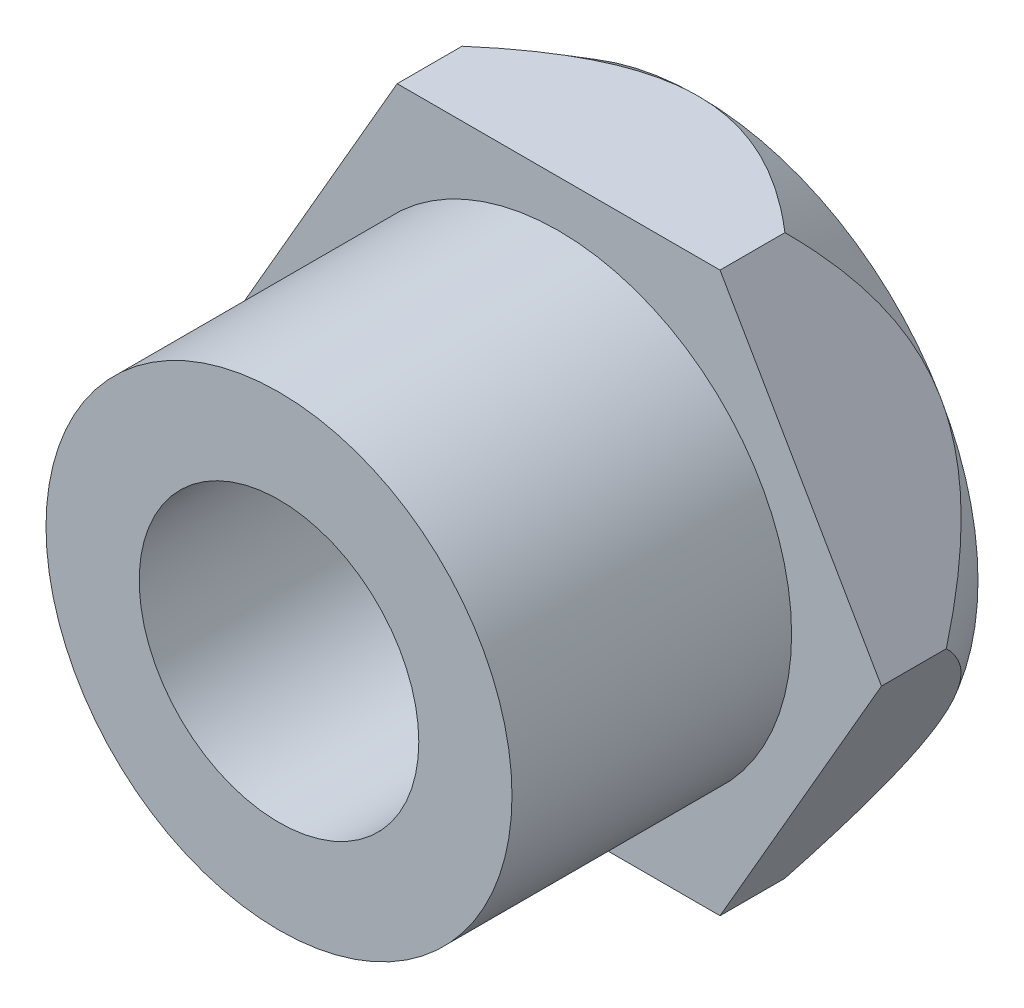
ISO-10303-21;
HEADER;
FILE_DESCRIPTION(('STEP AP214'),'2;1');
FILE_NAME('part.step','',(''),(''),'','','');
FILE_SCHEMA(('AUTOMOTIVE_DESIGN { 1 0 10303 214 1 1 1 1 }'));
ENDSEC;
DATA;
#1=APPLICATION_CONTEXT('core data for automotive mechanical design processes');
#2=APPLICATION_PROTOCOL_DEFINITION('international standard','automotive_design',2000,#1);
#3=PRODUCT_CONTEXT('',#1,'mechanical');
#4=PRODUCT('Part','Part','',(#3));
#5=PRODUCT_RELATED_PRODUCT_CATEGORY('part','',(#4));
#6=PRODUCT_DEFINITION_FORMATION('','',#4);
#7=PRODUCT_DEFINITION_CONTEXT('part definition',#1,'design');
#8=PRODUCT_DEFINITION('design','',#6,#7);
#9=PRODUCT_DEFINITION_SHAPE('','',#8);
#10=(LENGTH_UNIT() NAMED_UNIT(*) SI_UNIT(.MILLI.,.METRE.));
#11=(NAMED_UNIT(*) PLANE_ANGLE_UNIT() SI_UNIT($,.RADIAN.));
#12=(NAMED_UNIT(*) SI_UNIT($,.STERADIAN.) SOLID_ANGLE_UNIT());
#13=UNCERTAINTY_MEASURE_WITH_UNIT(LENGTH_MEASURE(1.E-05),#10,'distance_accuracy_value','');
#14=(GEOMETRIC_REPRESENTATION_CONTEXT(3) GLOBAL_UNCERTAINTY_ASSIGNED_CONTEXT((#13)) GLOBAL_UNIT_ASSIGNED_CONTEXT((#10,
#11,#12)) REPRESENTATION_CONTEXT('',''));
#15=CARTESIAN_POINT('',(0.,0.,0.));
#16=DIRECTION('',(0.,0.,1.));
#17=DIRECTION('',(1.,0.,0.));
#18=AXIS2_PLACEMENT_3D('',#15,#16,#17);
#19=CARTESIAN_POINT('',(0.,-6.,-3.));
#20=DIRECTION('',(0.,-1.,0.));
#21=DIRECTION('',(0.,0.,-1.));
#22=AXIS2_PLACEMENT_3D('',#19,#20,#21);
#23=PLANE('',#22);
#24=DIRECTION('',(0.,0.,1.));
#25=VECTOR('',#24,1.);
#26=CARTESIAN_POINT('',(-3.46410161513775,-6.,-3.));
#27=LINE('',#26,#25);
#28=CARTESIAN_POINT('',(-3.46410161513775,-6.,-1.39230484541327));
#29=VERTEX_POINT('',#28);
#30=CARTESIAN_POINT('',(-3.46410161513775,-6.,0.));
#31=VERTEX_POINT('',#30);
#32=EDGE_CURVE('E139',#29,#31,#27,.T.);
#33=ORIENTED_EDGE('',*,*,#32,.F.);
#34=CARTESIAN_POINT('',(-14.525665895704,-6.,13.8287331425263));
#35=CARTESIAN_POINT('',(-14.1876560315219,-6.,13.28770336066));
#36=CARTESIAN_POINT('',(-13.8484721873894,-6.,12.7474015767383));
#37=CARTESIAN_POINT('',(-13.1670169012934,-6.,11.668671847982));
#38=CARTESIAN_POINT('',(-12.8247451453677,-6.,11.1302441015809));
#39=CARTESIAN_POINT('',(-12.1348811985181,-6.,10.053352778885));
#40=CARTESIAN_POINT('',(-11.787271907643,-6.,9.51490013765862));
#41=CARTESIAN_POINT('',(-11.0872398083759,-6.,8.44118594861758));
#42=CARTESIAN_POINT('',(-10.7348173490697,-6.,7.90592417338058));
#43=CARTESIAN_POINT('',(-9.99022260091387,-6.,6.78935141206877));
#44=CARTESIAN_POINT('',(-9.59743230812274,-6.,6.20845058306485));
#45=CARTESIAN_POINT('',(-9.00043355178168,-6.,5.34237654097962));
#46=CARTESIAN_POINT('',(-8.80010576147922,-6.,5.0545284396966));
#47=CARTESIAN_POINT('',(-8.39634529802322,-6.,4.48101863023583));
#48=CARTESIAN_POINT('',(-8.19291265597924,-6.,4.19535690019439));
#49=CARTESIAN_POINT('',(-7.78277012687411,-6.,3.62736385961912));
#50=CARTESIAN_POINT('',(-7.57606859680609,-6.,3.34502652462225));
#51=CARTESIAN_POINT('',(-7.15812942454579,-6.,2.78373149406129));
#52=CARTESIAN_POINT('',(-6.94689190179616,-6.,2.50477370980802));
#53=CARTESIAN_POINT('',(-6.51887820696166,-6.,1.95130951544512));
#54=CARTESIAN_POINT('',(-6.3021043015253,-6.,1.67680135654005));
#55=CARTESIAN_POINT('',(-5.86150286776661,-6.,1.13352125640082));
#56=CARTESIAN_POINT('',(-5.63767624322046,-6.,0.864748587531808));
#57=CARTESIAN_POINT('',(-5.30028871538885,-6.,0.473467845438287));
#58=CARTESIAN_POINT('',(-5.19023694454021,-6.,0.347931544161698));
#59=CARTESIAN_POINT('',(-4.96776390530545,-6.,0.0989652192099315));
#60=CARTESIAN_POINT('',(-4.85534257402532,-6.,-0.0244647484001783));
#61=CARTESIAN_POINT('',(-4.62770538942906,-6.,-0.26892760500191));
#62=CARTESIAN_POINT('',(-4.51248717460644,-6.,-0.389958299662215));
#63=CARTESIAN_POINT('',(-4.27895971963744,-6.,-0.629003418030104));
#64=CARTESIAN_POINT('',(-4.16065054972091,-6.,-0.747017910148772));
#65=CARTESIAN_POINT('',(-3.92160785392386,-6.,-0.978288115256495));
#66=CARTESIAN_POINT('',(-3.80090769156382,-6.,-1.09157819888116));
#67=CARTESIAN_POINT('',(-3.55550280958449,-6.,-1.31373030473975));
#68=CARTESIAN_POINT('',(-3.4307984862023,-6.,-1.42259276271352));
#69=CARTESIAN_POINT('',(-3.1769306531798,-6.,-1.63468557575099));
#70=CARTESIAN_POINT('',(-3.04777290534952,-6.,-1.73792279295484));
#71=CARTESIAN_POINT('',(-2.78422452942043,-6.,-1.93745536096679));
#72=CARTESIAN_POINT('',(-2.64983564769913,-6.,-2.03375299840737));
#73=CARTESIAN_POINT('',(-2.39792314658457,-6.,-2.20228091561611));
#74=CARTESIAN_POINT('',(-2.28130139974355,-6.,-2.27585328694871));
#75=CARTESIAN_POINT('',(-2.04357504001449,-6.,-2.41546175046021));
#76=CARTESIAN_POINT('',(-1.92246995381644,-6.,-2.48149704392129));
#77=CARTESIAN_POINT('',(-1.67593950994499,-6.,-2.6041345223121));
#78=CARTESIAN_POINT('',(-1.55052664732508,-6.,-2.66076159934365));
#79=CARTESIAN_POINT('',(-1.29522782362561,-6.,-2.76278642724512));
#80=CARTESIAN_POINT('',(-1.16534461593048,-6.,-2.80819095416053));
#81=CARTESIAN_POINT('',(-0.93589025209861,-6.,-2.87565656704549));
#82=CARTESIAN_POINT('',(-0.83719987922622,-6.,-2.90071772139546));
#83=CARTESIAN_POINT('',(-0.638152789943831,-6.,-2.94278415582805));
#84=CARTESIAN_POINT('',(-0.537797023554316,-6.,-2.9597938756936));
#85=CARTESIAN_POINT('',(-0.336027138597748,-6.,-2.98517316076419));
#86=CARTESIAN_POINT('',(-0.23461342870032,-6.,-2.99354594593779));
#87=CARTESIAN_POINT('',(-0.0314376777045828,-6.,-3.00134634484786));
#88=CARTESIAN_POINT('',(0.0703243701776975,-6.,-3.00077378336906));
#89=CARTESIAN_POINT('',(0.273374578172224,-6.,-2.99070274069287));
#90=CARTESIAN_POINT('',(0.374662871829919,-6.,-2.9812069489529));
#91=CARTESIAN_POINT('',(0.576083679351694,-6.,-2.95366037054333));
#92=CARTESIAN_POINT('',(0.676215694091616,-6.,-2.93560602118595));
#93=CARTESIAN_POINT('',(0.973939169169642,-6.,-2.86948135602711));
#94=CARTESIAN_POINT('',(1.1689481557065,-6.,-2.80944409294679));
#95=CARTESIAN_POINT('',(1.51039590817157,-6.,-2.6788590551345));
#96=CARTESIAN_POINT('',(1.65867727623213,-6.,-2.61289729953798));
#97=CARTESIAN_POINT('',(1.94893120752583,-6.,-2.46815238484634));
#98=CARTESIAN_POINT('',(2.09089932276625,-6.,-2.38936036285797));
#99=CARTESIAN_POINT('',(2.37029355417492,-6.,-2.22078839863684));
#100=CARTESIAN_POINT('',(2.50764956485619,-6.,-2.13089357988822));
#101=CARTESIAN_POINT('',(2.70939898681911,-6.,-1.99005923906281));
#102=CARTESIAN_POINT('',(2.77592234341975,-6.,-1.94212554368176));
#103=CARTESIAN_POINT('',(2.90764118972774,-6.,-1.84446937847076));
#104=CARTESIAN_POINT('',(2.97283671243422,-6.,-1.79474695317923));
#105=CARTESIAN_POINT('',(3.17909279890074,-6.,-1.63339823054922));
#106=CARTESIAN_POINT('',(3.3177913435588,-6.,-1.51874464275381));
#107=CARTESIAN_POINT('',(3.59005729692872,-6.,-1.28347320483575));
#108=CARTESIAN_POINT('',(3.72362316276059,-6.,-1.16285358586592));
#109=CARTESIAN_POINT('',(3.98645648180759,-6.,-0.916777166924977));
#110=CARTESIAN_POINT('',(4.11571953232162,-6.,-0.791315679875277));
#111=CARTESIAN_POINT('',(4.37043679395749,-6.,-0.53657490594788));
#112=CARTESIAN_POINT('',(4.49589060284342,-6.,-0.407295218712041));
#113=CARTESIAN_POINT('',(4.86873639172909,-6.,-0.0133491189868541));
#114=CARTESIAN_POINT('',(5.1111513748519,-6.,0.256027467089859));
#115=CARTESIAN_POINT('',(5.58587091727055,-6.,0.803192630399627));
#116=CARTESIAN_POINT('',(5.8181808989327,-6.,1.08097655706445));
#117=CARTESIAN_POINT('',(6.25187379078521,-6.,1.61420057652674));
#118=CARTESIAN_POINT('',(6.45399891521664,-6.,1.86903929517489));
#119=CARTESIAN_POINT('',(6.85327852758467,-6.,2.38263459876702));
#120=CARTESIAN_POINT('',(7.05043222593504,-6.,2.64139179574694));
#121=CARTESIAN_POINT('',(7.43823211972264,-6.,3.15872160525041));
#122=CARTESIAN_POINT('',(7.62892874596863,-6.,3.4172565182725));
#123=CARTESIAN_POINT('',(8.00693327842683,-6.,3.93668301911708));
#124=CARTESIAN_POINT('',(8.19424212179668,-6.,4.1975739243113));
#125=CARTESIAN_POINT('',(8.38020649275338,-6.,4.45940606932979));
#126=B_SPLINE_CURVE_WITH_KNOTS('',3,(#34,#35,#36,#37,#38,#39,#40,#41,#42,#43,#44,#45,#46,#47,
#48,#49,#50,#51,#52,#53,#54,#55,#56,#57,#58,#59,#60,#61,#62,#63,#64,#65,#66,#67,#68,#69,#70,#71,
#72,#73,#74,#75,#76,#77,#78,#79,#80,#81,#82,#83,#84,#85,#86,#87,#88,#89,#90,#91,#92,#93,#94,#95,
#96,#97,#98,#99,#100,#101,#102,#103,#104,#105,#106,#107,#108,#109,#110,#111,#112,#113,#114,#115,
#116,#117,#118,#119,#120,#121,#122,#123,#124,#125),.UNSPECIFIED.,.F.,.F.,(4,2,2,2,2,2,2,2,2,2,2,
2,2,2,2,2,2,2,2,2,2,2,2,2,2,2,2,2,2,2,2,2,2,2,2,2,2,2,2,2,2,2,2,2,2,4),(0.,1.91381692693249,
3.82783068393693,5.75053401556787,7.67309863161511,9.77670820053761,10.8287807328347,
11.880842730634,12.9305493100532,13.9802282822013,15.0294841848199,16.0786061722087,
16.5794185100239,17.0802441574207,17.5815084846296,18.0827614324558,18.5792895879335,
19.0757687593186,19.5716280626324,20.0673232231369,20.4807636097915,20.8942477688752,
21.3066198888774,21.7187424117908,22.0239147746151,22.328918660378,22.633808795338,
22.9387049022826,23.2435091431472,23.5484403770464,24.1580353823147,24.6442620263829,
25.1308259822119,25.6229290413774,25.8688862161273,26.1148372709081,26.6544532500837,
27.1942301884631,27.7345434417144,28.2749135521787,29.3617106928989,30.447917274325,
31.4236358697255,32.3995084697067,33.3632486882581,34.3267181002429),.UNSPECIFIED.);
#127=CARTESIAN_POINT('',(0.,-6.,-3.));
#128=VERTEX_POINT('',#127);
#129=EDGE_CURVE('E126',#29,#128,#126,.T.);
#130=ORIENTED_EDGE('',*,*,#129,.T.);
#131=CARTESIAN_POINT('',(3.46410161513776,-6.,-1.39230484541327));
#132=VERTEX_POINT('',#131);
#133=EDGE_CURVE('E147',#128,#132,#126,.T.);
#134=ORIENTED_EDGE('',*,*,#133,.T.);
#135=DIRECTION('',(0.,0.,1.));
#136=VECTOR('',#135,1.);
#137=CARTESIAN_POINT('',(3.46410161513776,-6.,-3.));
#138=LINE('',#137,#136);
#139=CARTESIAN_POINT('',(3.46410161513776,-6.,0.));
#140=VERTEX_POINT('',#139);
#141=EDGE_CURVE('E248',#132,#140,#138,.T.);
#142=ORIENTED_EDGE('',*,*,#141,.T.);
#143=DIRECTION('',(1.,0.,0.));
#144=VECTOR('',#143,1.);
#145=CARTESIAN_POINT('',(0.,-6.,0.));
#146=LINE('',#145,#144);
#147=EDGE_CURVE('E232',#31,#140,#146,.T.);
#148=ORIENTED_EDGE('',*,*,#147,.F.);
#149=EDGE_LOOP('',(#33,#130,#134,#142,#148));
#150=FACE_BOUND('',#149,.T.);
#151=ADVANCED_FACE('F45',(#150),#23,.T.);
#152=CARTESIAN_POINT('',(-5.19615242270663,-3.,-3.));
#153=DIRECTION('',(-0.866025403784439,-0.5,0.));
#154=DIRECTION('',(0.5,-0.866025403784439,0.));
#155=AXIS2_PLACEMENT_3D('',#152,#153,#154);
#156=PLANE('',#155);
#157=DIRECTION('',(0.,0.,1.));
#158=VECTOR('',#157,1.);
#159=CARTESIAN_POINT('',(-6.92820323027551,0.,-3.));
#160=LINE('',#159,#158);
#161=CARTESIAN_POINT('',(-6.92820323027551,0.,-1.39230484541327));
#162=VERTEX_POINT('',#161);
#163=CARTESIAN_POINT('',(-6.92820323027551,0.,0.));
#164=VERTEX_POINT('',#163);
#165=EDGE_CURVE('E236',#162,#164,#160,.T.);
#166=ORIENTED_EDGE('',*,*,#165,.F.);
#167=CARTESIAN_POINT('',(-6.92831870032935,0.0002,-1.39210484041335));
#168=CARTESIAN_POINT('',(-6.8920869633287,-0.0625552093315998,-1.45485675595771));
#169=CARTESIAN_POINT('',(-6.85549370210164,-0.125936596991494,-1.51677172124381));
#170=CARTESIAN_POINT('',(-6.7815045563984,-0.254089556558126,-1.63869443638299));
#171=CARTESIAN_POINT('',(-6.74410844595277,-0.318861519855423,-1.69870163716831));
#172=CARTESIAN_POINT('',(-6.63024242921768,-0.516083246096078,-1.87605841647709));
#173=CARTESIAN_POINT('',(-6.55246251673888,-0.650802006317628,-1.99009861894057));
#174=CARTESIAN_POINT('',(-6.39084778580349,-0.930726931549287,-2.20930572434907));
#175=CARTESIAN_POINT('',(-6.3069084502023,-1.07611412556413,-2.31416725067041));
#176=CARTESIAN_POINT('',(-6.13448260570184,-1.37476444877689,-2.50717650652359));
#177=CARTESIAN_POINT('',(-6.04600671673824,-1.52800918370668,-2.59536119200583));
#178=CARTESIAN_POINT('',(-5.90577839570092,-1.7708917604034,-2.71451000869106));
#179=CARTESIAN_POINT('',(-5.85566748097545,-1.85768641072166,-2.7532351692419));
#180=CARTESIAN_POINT('',(-5.75413320753418,-2.03354893103153,-2.82317908837137));
#181=CARTESIAN_POINT('',(-5.70270975086725,-2.12261697067947,-2.85439728490508));
#182=CARTESIAN_POINT('',(-5.59916405758544,-2.30196337234849,-2.90813386547574));
#183=CARTESIAN_POINT('',(-5.54705057562585,-2.39222657086184,-2.930719165135));
#184=CARTESIAN_POINT('',(-5.4420393287988,-2.57411138573245,-2.96672152481618));
#185=CARTESIAN_POINT('',(-5.38914171254399,-2.66573274468506,-2.98014029998364));
#186=CARTESIAN_POINT('',(-5.2824607520727,-2.85050958842158,-2.99735322204494));
#187=CARTESIAN_POINT('',(-5.22867373774149,-2.94367143003066,-3.00105753823405));
#188=CARTESIAN_POINT('',(-5.12116250630929,-3.12988634525554,-2.99842181898061));
#189=CARTESIAN_POINT('',(-5.06743828899315,-3.22293941924397,-2.99208181805078));
#190=CARTESIAN_POINT('',(-4.96039142119213,-3.40835003306643,-2.96960528020867));
#191=CARTESIAN_POINT('',(-4.90706989989749,-3.50070561708562,-2.95344744071267));
#192=CARTESIAN_POINT('',(-4.80130579190307,-3.68389442574915,-2.91195793926411));
#193=CARTESIAN_POINT('',(-4.7488637543157,-3.77472669930292,-2.88662075402466));
#194=CARTESIAN_POINT('',(-4.63019825835143,-3.98026136741839,-2.81915295724708));
#195=CARTESIAN_POINT('',(-4.56436391171751,-4.09428980067144,-2.77428628903776));
#196=CARTESIAN_POINT('',(-4.43496480352885,-4.3184156305083,-2.6729245471899));
#197=CARTESIAN_POINT('',(-4.37140147078448,-4.42851055231996,-2.61642229909938));
#198=CARTESIAN_POINT('',(-4.24638972905437,-4.64503724053919,-2.49362203700486));
#199=CARTESIAN_POINT('',(-4.18495089019355,-4.75145243100416,-2.4272854116139));
#200=CARTESIAN_POINT('',(-4.06438436729459,-4.96027977435708,-2.28680494126698));
#201=CARTESIAN_POINT('',(-4.00525630509683,-5.0626925822367,-2.21266238115391));
#202=CARTESIAN_POINT('',(-3.86207423131302,-5.31069120876333,-2.02203868728376));
#203=CARTESIAN_POINT('',(-3.7792323704976,-5.45417752068918,-1.90191731472982));
#204=CARTESIAN_POINT('',(-3.65839054815158,-5.6634816966717,-1.71492271544501));
#205=CARTESIAN_POINT('',(-3.61889395301475,-5.73189180617467,-1.65183130517655));
#206=CARTESIAN_POINT('',(-3.5407936203244,-5.86716555048239,-1.52350535345445));
#207=CARTESIAN_POINT('',(-3.50218970013959,-5.93402950161382,-1.45827125710034));
#208=CARTESIAN_POINT('',(-3.46398614508392,-6.0002,-1.39210484041336));
#209=B_SPLINE_CURVE_WITH_KNOTS('',3,(#167,#168,#169,#170,#171,#172,#173,#174,#175,#176,#177,
#178,#179,#180,#181,#182,#183,#184,#185,#186,#187,#188,#189,#190,#191,#192,#193,#194,#195,#196,
#197,#198,#199,#200,#201,#202,#203,#204,#205,#206,#207,#208),.UNSPECIFIED.,.F.,.F.,(4,2,2,2,2,2,
2,2,2,2,2,2,2,2,2,2,2,2,2,2,4),(0.,0.287561008327851,0.575204042943173,1.15341981792992,
1.74657454594263,2.33839902992177,2.66048498944148,2.98259505597094,3.30215513692593,
3.62165540870414,3.94409988466052,4.26654325268544,4.58968876384561,4.91302903810226,
5.32965656956922,5.74654176524241,6.16510933359142,6.5836081138595,7.19695565994919,
7.50021906137928,7.80341985952751),.UNSPECIFIED.);
#210=CARTESIAN_POINT('',(-5.19615242270663,-3.,-3.));
#211=VERTEX_POINT('',#210);
#212=EDGE_CURVE('E274',#162,#211,#209,.T.);
#213=ORIENTED_EDGE('',*,*,#212,.T.);
#214=EDGE_CURVE('E194',#211,#29,#209,.T.);
#215=ORIENTED_EDGE('',*,*,#214,.T.);
#216=ORIENTED_EDGE('',*,*,#32,.T.);
#217=DIRECTION('',(0.5,-0.866025403784439,0.));
#218=VECTOR('',#217,1.);
#219=CARTESIAN_POINT('',(-5.19615242270663,-3.,0.));
#220=LINE('',#219,#218);
#221=EDGE_CURVE('E241',#164,#31,#220,.T.);
#222=ORIENTED_EDGE('',*,*,#221,.F.);
#223=EDGE_LOOP('',(#166,#213,#215,#216,#222));
#224=FACE_BOUND('',#223,.T.);
#225=ADVANCED_FACE('F207',(#224),#156,.T.);
#226=CARTESIAN_POINT('',(-5.19615242270663,3.,-3.));
#227=DIRECTION('',(-0.866025403784438,0.5,0.));
#228=DIRECTION('',(-0.5,-0.866025403784439,0.));
#229=AXIS2_PLACEMENT_3D('',#226,#227,#228);
#230=PLANE('',#229);
#231=DIRECTION('',(0.,0.,1.));
#232=VECTOR('',#231,1.);
#233=CARTESIAN_POINT('',(-3.46410161513775,6.,-3.));
#234=LINE('',#233,#232);
#235=CARTESIAN_POINT('',(-3.46410161513775,6.,-1.39230484541327));
#236=VERTEX_POINT('',#235);
#237=CARTESIAN_POINT('',(-3.46410161513775,6.,0.));
#238=VERTEX_POINT('',#237);
#239=EDGE_CURVE('E238',#236,#238,#234,.T.);
#240=ORIENTED_EDGE('',*,*,#239,.F.);
#241=CARTESIAN_POINT('',(-3.46398614508392,6.0002,-1.39210484041335));
#242=CARTESIAN_POINT('',(-3.50021788208457,5.9374447906684,-1.45485675595771));
#243=CARTESIAN_POINT('',(-3.53681114331162,5.8740634030085,-1.51677172124381));
#244=CARTESIAN_POINT('',(-3.61080028901486,5.74591044344187,-1.63869443638299));
#245=CARTESIAN_POINT('',(-3.6481963994605,5.68113848014458,-1.69870163716831));
#246=CARTESIAN_POINT('',(-3.76206241619558,5.48391675390392,-1.87605841647709));
#247=CARTESIAN_POINT('',(-3.83984232867439,5.34919799368237,-1.99009861894057));
#248=CARTESIAN_POINT('',(-4.00145705960977,5.06927306845071,-2.20930572434906));
#249=CARTESIAN_POINT('',(-4.08539639521096,4.92388587443587,-2.31416725067041));
#250=CARTESIAN_POINT('',(-4.25782223971142,4.6252355512231,-2.50717650652359));
#251=CARTESIAN_POINT('',(-4.34629812867502,4.47199081629332,-2.59536119200583));
#252=CARTESIAN_POINT('',(-4.48652644971235,4.2291082395966,-2.71451000869106));
#253=CARTESIAN_POINT('',(-4.53663736443782,4.14231358927834,-2.7532351692419));
#254=CARTESIAN_POINT('',(-4.63817163787909,3.96645106896847,-2.82317908837137));
#255=CARTESIAN_POINT('',(-4.68959509454602,3.87738302932053,-2.85439728490508));
#256=CARTESIAN_POINT('',(-4.79314078782782,3.69803662765151,-2.90813386547574));
#257=CARTESIAN_POINT('',(-4.84525426978741,3.60777342913816,-2.930719165135));
#258=CARTESIAN_POINT('',(-4.95026551661447,3.42588861426755,-2.96672152481618));
#259=CARTESIAN_POINT('',(-5.00316313286928,3.33426725531494,-2.98014029998364));
#260=CARTESIAN_POINT('',(-5.10984409334057,3.14949041157842,-2.99735322204493));
#261=CARTESIAN_POINT('',(-5.16363110767177,3.05632856996934,-3.00105753823405));
#262=CARTESIAN_POINT('',(-5.27114233910398,2.87011365474446,-2.99842181898061));
#263=CARTESIAN_POINT('',(-5.32486655642012,2.77706058075603,-2.99208181805078));
#264=CARTESIAN_POINT('',(-5.43191342422113,2.59164996693357,-2.96960528020867));
#265=CARTESIAN_POINT('',(-5.48523494551577,2.49929438291438,-2.95344744071266));
#266=CARTESIAN_POINT('',(-5.59099905351019,2.31610557425085,-2.91195793926411));
#267=CARTESIAN_POINT('',(-5.64344109109756,2.22527330069708,-2.88662075402465));
#268=CARTESIAN_POINT('',(-5.76210658706183,2.01973863258161,-2.81915295724708));
#269=CARTESIAN_POINT('',(-5.82794093369575,1.90571019932856,-2.77428628903776));
#270=CARTESIAN_POINT('',(-5.95734004188441,1.6815843694917,-2.6729245471899));
#271=CARTESIAN_POINT('',(-6.02090337462878,1.57148944768004,-2.61642229909938));
#272=CARTESIAN_POINT('',(-6.14591511635889,1.35496275946081,-2.49362203700485));
#273=CARTESIAN_POINT('',(-6.20735395521971,1.24854756899584,-2.4272854116139));
#274=CARTESIAN_POINT('',(-6.32792047811867,1.03972022564292,-2.28680494126697));
#275=CARTESIAN_POINT('',(-6.38704854031644,0.937307417763302,-2.21266238115391));
#276=CARTESIAN_POINT('',(-6.53023061410024,0.689308791236668,-2.02203868728375));
#277=CARTESIAN_POINT('',(-6.61307247491566,0.545822479310821,-1.90191731472982));
#278=CARTESIAN_POINT('',(-6.73391429726168,0.336518303328302,-1.71492271544501));
#279=CARTESIAN_POINT('',(-6.77341089239851,0.268108193825327,-1.65183130517655));
#280=CARTESIAN_POINT('',(-6.85151122508886,0.132834449517608,-1.52350535345445));
#281=CARTESIAN_POINT('',(-6.89011514527367,0.0659704983861811,-1.45827125710033));
#282=CARTESIAN_POINT('',(-6.92831870032935,-0.000200000000000444,-1.39210484041335));
#283=B_SPLINE_CURVE_WITH_KNOTS('',3,(#241,#242,#243,#244,#245,#246,#247,#248,#249,#250,#251,
#252,#253,#254,#255,#256,#257,#258,#259,#260,#261,#262,#263,#264,#265,#266,#267,#268,#269,#270,
#271,#272,#273,#274,#275,#276,#277,#278,#279,#280,#281,#282),.UNSPECIFIED.,.F.,.F.,(4,2,2,2,2,2,
2,2,2,2,2,2,2,2,2,2,2,2,2,2,4),(0.,0.287561008327851,0.575204042943172,1.15341981792992,
1.74657454594263,2.33839902992177,2.66048498944148,2.98259505597094,3.30215513692593,
3.62165540870414,3.94409988466052,4.26654325268544,4.58968876384561,4.91302903810226,
5.32965656956922,5.74654176524241,6.16510933359142,6.5836081138595,7.19695565994919,
7.50021906137928,7.80341985952752),.UNSPECIFIED.);
#284=CARTESIAN_POINT('',(-5.19615242270663,3.,-3.));
#285=VERTEX_POINT('',#284);
#286=EDGE_CURVE('E257',#236,#285,#283,.T.);
#287=ORIENTED_EDGE('',*,*,#286,.T.);
#288=EDGE_CURVE('E68',#285,#162,#283,.T.);
#289=ORIENTED_EDGE('',*,*,#288,.T.);
#290=ORIENTED_EDGE('',*,*,#165,.T.);
#291=DIRECTION('',(-0.5,-0.866025403784439,0.));
#292=VECTOR('',#291,1.);
#293=CARTESIAN_POINT('',(-5.19615242270663,3.,0.));
#294=LINE('',#293,#292);
#295=EDGE_CURVE('E268',#238,#164,#294,.T.);
#296=ORIENTED_EDGE('',*,*,#295,.F.);
#297=EDGE_LOOP('',(#240,#287,#289,#290,#296));
#298=FACE_BOUND('',#297,.T.);
#299=ADVANCED_FACE('F203',(#298),#230,.T.);
#300=CARTESIAN_POINT('',(0.,6.,-3.));
#301=DIRECTION('',(0.,1.,0.));
#302=DIRECTION('',(0.,0.,1.));
#303=AXIS2_PLACEMENT_3D('',#300,#301,#302);
#304=PLANE('',#303);
#305=DIRECTION('',(0.,0.,1.));
#306=VECTOR('',#305,1.);
#307=CARTESIAN_POINT('',(3.46410161513775,6.,-3.));
#308=LINE('',#307,#306);
#309=CARTESIAN_POINT('',(3.46410161513775,6.,-1.39230484541327));
#310=VERTEX_POINT('',#309);
#311=CARTESIAN_POINT('',(3.46410161513775,6.,0.));
#312=VERTEX_POINT('',#311);
#313=EDGE_CURVE('E245',#310,#312,#308,.T.);
#314=ORIENTED_EDGE('',*,*,#313,.F.);
#315=CARTESIAN_POINT('',(-14.525665895704,6.,13.8287331425263));
#316=CARTESIAN_POINT('',(-14.1876560315219,6.,13.28770336066));
#317=CARTESIAN_POINT('',(-13.8484721873894,6.,12.7474015767384));
#318=CARTESIAN_POINT('',(-13.1670169012934,6.,11.668671847982));
#319=CARTESIAN_POINT('',(-12.8247451453677,6.,11.1302441015809));
#320=CARTESIAN_POINT('',(-12.1348811985181,6.,10.053352778885));
#321=CARTESIAN_POINT('',(-11.7872719076431,6.,9.51490013765862));
#322=CARTESIAN_POINT('',(-11.0872398083759,6.,8.44118594861759));
#323=CARTESIAN_POINT('',(-10.7348173490697,6.,7.90592417338059));
#324=CARTESIAN_POINT('',(-9.99022260091388,6.,6.78935141206878));
#325=CARTESIAN_POINT('',(-9.59743230812274,6.,6.20845058306486));
#326=CARTESIAN_POINT('',(-9.00043355178169,6.,5.34237654097963));
#327=CARTESIAN_POINT('',(-8.80010576147922,6.,5.05452843969661));
#328=CARTESIAN_POINT('',(-8.39634529802322,6.,4.48101863023584));
#329=CARTESIAN_POINT('',(-8.19291265597925,6.,4.1953569001944));
#330=CARTESIAN_POINT('',(-7.78277012687411,6.,3.62736385961913));
#331=CARTESIAN_POINT('',(-7.5760685968061,6.,3.34502652462225));
#332=CARTESIAN_POINT('',(-7.15812942454579,6.,2.78373149406129));
#333=CARTESIAN_POINT('',(-6.94689190179617,6.,2.50477370980802));
#334=CARTESIAN_POINT('',(-6.51887820696166,6.,1.95130951544512));
#335=CARTESIAN_POINT('',(-6.3021043015253,6.,1.67680135654005));
#336=CARTESIAN_POINT('',(-5.86150286776661,6.,1.13352125640083));
#337=CARTESIAN_POINT('',(-5.63767624322047,6.,0.864748587531812));
#338=CARTESIAN_POINT('',(-5.30028871538885,6.,0.473467845438291));
#339=CARTESIAN_POINT('',(-5.19023694454022,6.,0.347931544161703));
#340=CARTESIAN_POINT('',(-4.96776390530546,6.,0.0989652192099357));
#341=CARTESIAN_POINT('',(-4.85534257402532,6.,-0.0244647484001753));
#342=CARTESIAN_POINT('',(-4.62770538942906,6.,-0.268927605001909));
#343=CARTESIAN_POINT('',(-4.51248717460644,6.,-0.389958299662216));
#344=CARTESIAN_POINT('',(-4.27895971963744,6.,-0.629003418030104));
#345=CARTESIAN_POINT('',(-4.16065054972091,6.,-0.747017910148771));
#346=CARTESIAN_POINT('',(-3.92160785392386,6.,-0.978288115256493));
#347=CARTESIAN_POINT('',(-3.80090769156382,6.,-1.09157819888116));
#348=CARTESIAN_POINT('',(-3.55550280958449,6.,-1.31373030473975));
#349=CARTESIAN_POINT('',(-3.4307984862023,6.,-1.42259276271352));
#350=CARTESIAN_POINT('',(-3.1769306531798,6.,-1.63468557575099));
#351=CARTESIAN_POINT('',(-3.04777290534953,6.,-1.73792279295484));
#352=CARTESIAN_POINT('',(-2.78422452942043,6.,-1.93745536096679));
#353=CARTESIAN_POINT('',(-2.64983564769913,6.,-2.03375299840737));
#354=CARTESIAN_POINT('',(-2.39792314658457,6.,-2.20228091561611));
#355=CARTESIAN_POINT('',(-2.28130139974355,6.,-2.27585328694871));
#356=CARTESIAN_POINT('',(-2.04357504001449,6.,-2.41546175046021));
#357=CARTESIAN_POINT('',(-1.92246995381644,6.,-2.48149704392129));
#358=CARTESIAN_POINT('',(-1.67593950994499,6.,-2.6041345223121));
#359=CARTESIAN_POINT('',(-1.55052664732508,6.,-2.66076159934364));
#360=CARTESIAN_POINT('',(-1.29522782362561,6.,-2.76278642724512));
#361=CARTESIAN_POINT('',(-1.16534461593048,6.,-2.80819095416053));
#362=CARTESIAN_POINT('',(-0.935890252098611,6.,-2.87565656704549));
#363=CARTESIAN_POINT('',(-0.837199879226221,6.,-2.90071772139546));
#364=CARTESIAN_POINT('',(-0.638152789943831,6.,-2.94278415582805));
#365=CARTESIAN_POINT('',(-0.537797023554316,6.,-2.9597938756936));
#366=CARTESIAN_POINT('',(-0.336027138597746,6.,-2.98517316076419));
#367=CARTESIAN_POINT('',(-0.234613428700318,6.,-2.99354594593778));
#368=CARTESIAN_POINT('',(-0.031437677704582,6.,-3.00134634484785));
#369=CARTESIAN_POINT('',(0.0703243701776972,6.,-3.00077378336906));
#370=CARTESIAN_POINT('',(0.273374578172221,6.,-2.99070274069287));
#371=CARTESIAN_POINT('',(0.374662871829915,6.,-2.9812069489529));
#372=CARTESIAN_POINT('',(0.576083679351688,6.,-2.95366037054333));
#373=CARTESIAN_POINT('',(0.676215694091611,6.,-2.93560602118595));
#374=CARTESIAN_POINT('',(0.973939169169638,6.,-2.86948135602711));
#375=CARTESIAN_POINT('',(1.1689481557065,6.,-2.80944409294679));
#376=CARTESIAN_POINT('',(1.51039590817157,6.,-2.6788590551345));
#377=CARTESIAN_POINT('',(1.65867727623213,6.,-2.61289729953798));
#378=CARTESIAN_POINT('',(1.94893120752582,6.,-2.46815238484634));
#379=CARTESIAN_POINT('',(2.09089932276625,6.,-2.38936036285796));
#380=CARTESIAN_POINT('',(2.37029355417492,6.,-2.22078839863684));
#381=CARTESIAN_POINT('',(2.50764956485618,6.,-2.13089357988821));
#382=CARTESIAN_POINT('',(2.7093989868191,6.,-1.99005923906281));
#383=CARTESIAN_POINT('',(2.77592234341975,6.,-1.94212554368176));
#384=CARTESIAN_POINT('',(2.90764118972774,6.,-1.84446937847076));
#385=CARTESIAN_POINT('',(2.97283671243422,6.,-1.79474695317923));
#386=CARTESIAN_POINT('',(3.17909279890074,6.,-1.63339823054922));
#387=CARTESIAN_POINT('',(3.3177913435588,6.,-1.51874464275381));
#388=CARTESIAN_POINT('',(3.59005729692872,6.,-1.28347320483575));
#389=CARTESIAN_POINT('',(3.72362316276059,6.,-1.16285358586592));
#390=CARTESIAN_POINT('',(3.98645648180759,6.,-0.916777166924978));
#391=CARTESIAN_POINT('',(4.11571953232162,6.,-0.791315679875278));
#392=CARTESIAN_POINT('',(4.37043679395748,6.,-0.536574905947882));
#393=CARTESIAN_POINT('',(4.49589060284342,6.,-0.407295218712043));
#394=CARTESIAN_POINT('',(4.86873639172909,6.,-0.0133491189868565));
#395=CARTESIAN_POINT('',(5.1111513748519,6.,0.256027467089856));
#396=CARTESIAN_POINT('',(5.58587091727054,6.,0.803192630399623));
#397=CARTESIAN_POINT('',(5.81818089893269,6.,1.08097655706444));
#398=CARTESIAN_POINT('',(6.25187379078521,6.,1.61420057652674));
#399=CARTESIAN_POINT('',(6.45399891521663,6.,1.86903929517488));
#400=CARTESIAN_POINT('',(6.85327852758466,6.,2.38263459876702));
#401=CARTESIAN_POINT('',(7.05043222593503,6.,2.64139179574693));
#402=CARTESIAN_POINT('',(7.43823211972264,6.,3.15872160525041));
#403=CARTESIAN_POINT('',(7.62892874596862,6.,3.41725651827249));
#404=CARTESIAN_POINT('',(8.00693327842683,6.,3.93668301911707));
#405=CARTESIAN_POINT('',(8.19424212179668,6.,4.19757392431129));
#406=CARTESIAN_POINT('',(8.38020649275337,6.,4.45940606932978));
#407=B_SPLINE_CURVE_WITH_KNOTS('',3,(#315,#316,#317,#318,#319,#320,#321,#322,#323,#324,#325,
#326,#327,#328,#329,#330,#331,#332,#333,#334,#335,#336,#337,#338,#339,#340,#341,#342,#343,#344,
#345,#346,#347,#348,#349,#350,#351,#352,#353,#354,#355,#356,#357,#358,#359,#360,#361,#362,#363,
#364,#365,#366,#367,#368,#369,#370,#371,#372,#373,#374,#375,#376,#377,#378,#379,#380,#381,#382,
#383,#384,#385,#386,#387,#388,#389,#390,#391,#392,#393,#394,#395,#396,#397,#398,#399,#400,#401,
#402,#403,#404,#405,#406),.UNSPECIFIED.,.F.,.F.,(4,2,2,2,2,2,2,2,2,2,2,2,2,2,2,2,2,2,2,2,2,2,2,
2,2,2,2,2,2,2,2,2,2,2,2,2,2,2,2,2,2,2,2,2,2,4),(0.,1.91381692693248,3.82783068393692,
5.75053401556786,7.6730986316151,9.7767082005376,10.8287807328346,11.880842730634,
12.9305493100532,13.9802282822013,15.0294841848199,16.0786061722086,16.5794185100239,
17.0802441574207,17.5815084846297,18.0827614324558,18.5792895879335,19.0757687593186,
19.5716280626324,20.0673232231369,20.4807636097915,20.8942477688752,21.3066198888774,
21.7187424117908,22.0239147746151,22.328918660378,22.633808795338,22.9387049022826,
23.2435091431472,23.5484403770464,24.1580353823147,24.6442620263829,25.1308259822119,
25.6229290413774,25.8688862161273,26.1148372709081,26.6544532500837,27.1942301884631,
27.7345434417144,28.2749135521787,29.3617106928989,30.447917274325,31.4236358697255,
32.3995084697067,33.3632486882581,34.3267181002429),.UNSPECIFIED.);
#408=CARTESIAN_POINT('',(0.,6.,-3.));
#409=VERTEX_POINT('',#408);
#410=EDGE_CURVE('E122',#310,#409,#407,.F.);
#411=ORIENTED_EDGE('',*,*,#410,.T.);
#412=EDGE_CURVE('E61',#409,#236,#407,.F.);
#413=ORIENTED_EDGE('',*,*,#412,.T.);
#414=ORIENTED_EDGE('',*,*,#239,.T.);
#415=DIRECTION('',(-1.,0.,0.));
#416=VECTOR('',#415,1.);
#417=CARTESIAN_POINT('',(0.,6.,0.));
#418=LINE('',#417,#416);
#419=EDGE_CURVE('E266',#312,#238,#418,.T.);
#420=ORIENTED_EDGE('',*,*,#419,.F.);
#421=EDGE_LOOP('',(#314,#411,#413,#414,#420));
#422=FACE_BOUND('',#421,.T.);
#423=ADVANCED_FACE('F200',(#422),#304,.T.);
#424=CARTESIAN_POINT('',(5.19615242270663,3.,-3.));
#425=DIRECTION('',(0.866025403784438,0.5,0.));
#426=DIRECTION('',(-0.5,0.866025403784438,0.));
#427=AXIS2_PLACEMENT_3D('',#424,#425,#426);
#428=PLANE('',#427);
#429=DIRECTION('',(0.,0.,1.));
#430=VECTOR('',#429,1.);
#431=CARTESIAN_POINT('',(6.92820323027551,0.,-3.));
#432=LINE('',#431,#430);
#433=CARTESIAN_POINT('',(6.92820323027551,0.,-1.39230484541326));
#434=VERTEX_POINT('',#433);
#435=CARTESIAN_POINT('',(6.92820323027551,0.,0.));
#436=VERTEX_POINT('',#435);
#437=EDGE_CURVE('E146',#434,#436,#432,.T.);
#438=ORIENTED_EDGE('',*,*,#437,.F.);
#439=CARTESIAN_POINT('',(6.92831870032935,-0.000200000000001735,-1.39210484041335));
#440=CARTESIAN_POINT('',(6.8920869633287,0.0625552093315984,-1.4548567559577));
#441=CARTESIAN_POINT('',(6.85549370210165,0.125936596991493,-1.5167717212438));
#442=CARTESIAN_POINT('',(6.78150455639841,0.254089556558124,-1.63869443638298));
#443=CARTESIAN_POINT('',(6.74410844595277,0.318861519855421,-1.6987016371683));
#444=CARTESIAN_POINT('',(6.63024242921769,0.516083246096075,-1.87605841647708));
#445=CARTESIAN_POINT('',(6.55246251673888,0.650802006317625,-1.99009861894057));
#446=CARTESIAN_POINT('',(6.3908477858035,0.930726931549285,-2.20930572434906));
#447=CARTESIAN_POINT('',(6.3069084502023,1.07611412556412,-2.31416725067041));
#448=CARTESIAN_POINT('',(6.13448260570184,1.37476444877689,-2.50717650652359));
#449=CARTESIAN_POINT('',(6.04600671673824,1.52800918370668,-2.59536119200583));
#450=CARTESIAN_POINT('',(5.90577839570092,1.77089176040339,-2.71451000869106));
#451=CARTESIAN_POINT('',(5.85566748097545,1.85768641072166,-2.7532351692419));
#452=CARTESIAN_POINT('',(5.75413320753418,2.03354893103153,-2.82317908837137));
#453=CARTESIAN_POINT('',(5.70270975086725,2.12261697067947,-2.85439728490508));
#454=CARTESIAN_POINT('',(5.59916405758545,2.30196337234849,-2.90813386547574));
#455=CARTESIAN_POINT('',(5.54705057562585,2.39222657086184,-2.930719165135));
#456=CARTESIAN_POINT('',(5.4420393287988,2.57411138573245,-2.96672152481618));
#457=CARTESIAN_POINT('',(5.38914171254399,2.66573274468506,-2.98014029998364));
#458=CARTESIAN_POINT('',(5.2824607520727,2.85050958842158,-2.99735322204493));
#459=CARTESIAN_POINT('',(5.2286737377415,2.94367143003066,-3.00105753823405));
#460=CARTESIAN_POINT('',(5.12116250630929,3.12988634525554,-2.99842181898061));
#461=CARTESIAN_POINT('',(5.06743828899315,3.22293941924397,-2.99208181805078));
#462=CARTESIAN_POINT('',(4.96039142119214,3.40835003306643,-2.96960528020867));
#463=CARTESIAN_POINT('',(4.9070698998975,3.50070561708561,-2.95344744071267));
#464=CARTESIAN_POINT('',(4.80130579190308,3.68389442574915,-2.91195793926411));
#465=CARTESIAN_POINT('',(4.7488637543157,3.77472669930292,-2.88662075402465));
#466=CARTESIAN_POINT('',(4.63019825835144,3.98026136741838,-2.81915295724708));
#467=CARTESIAN_POINT('',(4.56436391171752,4.09428980067143,-2.77428628903776));
#468=CARTESIAN_POINT('',(4.43496480352886,4.3184156305083,-2.6729245471899));
#469=CARTESIAN_POINT('',(4.37140147078448,4.42851055231995,-2.61642229909938));
#470=CARTESIAN_POINT('',(4.24638972905437,4.64503724053918,-2.49362203700486));
#471=CARTESIAN_POINT('',(4.18495089019356,4.75145243100416,-2.4272854116139));
#472=CARTESIAN_POINT('',(4.0643843672946,4.96027977435707,-2.28680494126698));
#473=CARTESIAN_POINT('',(4.00525630509683,5.0626925822367,-2.21266238115391));
#474=CARTESIAN_POINT('',(3.86207423131302,5.31069120876333,-2.02203868728376));
#475=CARTESIAN_POINT('',(3.77923237049761,5.45417752068918,-1.90191731472983));
#476=CARTESIAN_POINT('',(3.65839054815159,5.6634816966717,-1.71492271544501));
#477=CARTESIAN_POINT('',(3.61889395301475,5.73189180617467,-1.65183130517655));
#478=CARTESIAN_POINT('',(3.5407936203244,5.86716555048239,-1.52350535345445));
#479=CARTESIAN_POINT('',(3.50218970013959,5.93402950161382,-1.45827125710034));
#480=CARTESIAN_POINT('',(3.46398614508391,6.0002,-1.39210484041335));
#481=B_SPLINE_CURVE_WITH_KNOTS('',3,(#439,#440,#441,#442,#443,#444,#445,#446,#447,#448,#449,
#450,#451,#452,#453,#454,#455,#456,#457,#458,#459,#460,#461,#462,#463,#464,#465,#466,#467,#468,
#469,#470,#471,#472,#473,#474,#475,#476,#477,#478,#479,#480),.UNSPECIFIED.,.F.,.F.,(4,2,2,2,2,2,
2,2,2,2,2,2,2,2,2,2,2,2,2,2,4),(0.,0.28756100832785,0.575204042943172,1.15341981792992,
1.74657454594263,2.33839902992178,2.66048498944148,2.98259505597094,3.30215513692593,
3.62165540870415,3.94409988466052,4.26654325268544,4.58968876384561,4.91302903810226,
5.32965656956922,5.74654176524241,6.16510933359142,6.5836081138595,7.19695565994919,
7.50021906137929,7.80341985952752),.UNSPECIFIED.);
#482=CARTESIAN_POINT('',(5.19615242270663,3.,-3.));
#483=VERTEX_POINT('',#482);
#484=EDGE_CURVE('E128',#434,#483,#481,.T.);
#485=ORIENTED_EDGE('',*,*,#484,.T.);
#486=EDGE_CURVE('E116',#483,#310,#481,.T.);
#487=ORIENTED_EDGE('',*,*,#486,.T.);
#488=ORIENTED_EDGE('',*,*,#313,.T.);
#489=DIRECTION('',(-0.5,0.866025403784438,0.));
#490=VECTOR('',#489,1.);
#491=CARTESIAN_POINT('',(5.19615242270663,3.,0.));
#492=LINE('',#491,#490);
#493=EDGE_CURVE('E263',#436,#312,#492,.T.);
#494=ORIENTED_EDGE('',*,*,#493,.F.);
#495=EDGE_LOOP('',(#438,#485,#487,#488,#494));
#496=FACE_BOUND('',#495,.T.);
#497=ADVANCED_FACE('F144',(#496),#428,.T.);
#498=CARTESIAN_POINT('',(5.19615242270663,-3.,-3.));
#499=DIRECTION('',(0.866025403784439,-0.5,0.));
#500=DIRECTION('',(0.5,0.866025403784439,0.));
#501=AXIS2_PLACEMENT_3D('',#498,#499,#500);
#502=PLANE('',#501);
#503=ORIENTED_EDGE('',*,*,#141,.F.);
#504=CARTESIAN_POINT('',(3.46398614508392,-6.0002,-1.39210484041335));
#505=CARTESIAN_POINT('',(3.50021788208457,-5.9374447906684,-1.45485675595771));
#506=CARTESIAN_POINT('',(3.53681114331162,-5.8740634030085,-1.51677172124381));
#507=CARTESIAN_POINT('',(3.61080028901486,-5.74591044344187,-1.63869443638299));
#508=CARTESIAN_POINT('',(3.6481963994605,-5.68113848014458,-1.6987016371683));
#509=CARTESIAN_POINT('',(3.76206241619558,-5.48391675390392,-1.87605841647709));
#510=CARTESIAN_POINT('',(3.83984232867439,-5.34919799368237,-1.99009861894057));
#511=CARTESIAN_POINT('',(4.00145705960977,-5.06927306845071,-2.20930572434906));
#512=CARTESIAN_POINT('',(4.08539639521097,-4.92388587443587,-2.31416725067041));
#513=CARTESIAN_POINT('',(4.25782223971143,-4.6252355512231,-2.50717650652359));
#514=CARTESIAN_POINT('',(4.34629812867503,-4.47199081629332,-2.59536119200583));
#515=CARTESIAN_POINT('',(4.48652644971235,-4.2291082395966,-2.71451000869106));
#516=CARTESIAN_POINT('',(4.53663736443782,-4.14231358927834,-2.7532351692419));
#517=CARTESIAN_POINT('',(4.63817163787909,-3.96645106896846,-2.82317908837137));
#518=CARTESIAN_POINT('',(4.68959509454602,-3.87738302932052,-2.85439728490507));
#519=CARTESIAN_POINT('',(4.79314078782782,-3.6980366276515,-2.90813386547574));
#520=CARTESIAN_POINT('',(4.84525426978742,-3.60777342913816,-2.930719165135));
#521=CARTESIAN_POINT('',(4.95026551661447,-3.42588861426754,-2.96672152481618));
#522=CARTESIAN_POINT('',(5.00316313286928,-3.33426725531494,-2.98014029998364));
#523=CARTESIAN_POINT('',(5.10984409334057,-3.14949041157842,-2.99735322204493));
#524=CARTESIAN_POINT('',(5.16363110767177,-3.05632856996934,-3.00105753823405));
#525=CARTESIAN_POINT('',(5.27114233910398,-2.87011365474446,-2.99842181898061));
#526=CARTESIAN_POINT('',(5.32486655642012,-2.77706058075603,-2.99208181805078));
#527=CARTESIAN_POINT('',(5.43191342422113,-2.59164996693357,-2.96960528020867));
#528=CARTESIAN_POINT('',(5.48523494551577,-2.49929438291438,-2.95344744071266));
#529=CARTESIAN_POINT('',(5.59099905351019,-2.31610557425085,-2.9119579392641));
#530=CARTESIAN_POINT('',(5.64344109109757,-2.22527330069708,-2.88662075402465));
#531=CARTESIAN_POINT('',(5.76210658706183,-2.01973863258161,-2.81915295724708));
#532=CARTESIAN_POINT('',(5.82794093369575,-1.90571019932856,-2.77428628903775));
#533=CARTESIAN_POINT('',(5.95734004188441,-1.6815843694917,-2.67292454718989));
#534=CARTESIAN_POINT('',(6.02090337462878,-1.57148944768004,-2.61642229909938));
#535=CARTESIAN_POINT('',(6.14591511635889,-1.35496275946081,-2.49362203700485));
#536=CARTESIAN_POINT('',(6.20735395521971,-1.24854756899583,-2.42728541161389));
#537=CARTESIAN_POINT('',(6.32792047811868,-1.03972022564292,-2.28680494126696));
#538=CARTESIAN_POINT('',(6.38704854031644,-0.937307417763298,-2.2126623811539));
#539=CARTESIAN_POINT('',(6.53023061410025,-0.689308791236665,-2.02203868728375));
#540=CARTESIAN_POINT('',(6.61307247491566,-0.545822479310819,-1.90191731472982));
#541=CARTESIAN_POINT('',(6.73391429726168,-0.336518303328302,-1.714922715445));
#542=CARTESIAN_POINT('',(6.77341089239852,-0.268108193825327,-1.65183130517654));
#543=CARTESIAN_POINT('',(6.85151122508886,-0.132834449517609,-1.52350535345445));
#544=CARTESIAN_POINT('',(6.89011514527368,-0.065970498386183,-1.45827125710033));
#545=CARTESIAN_POINT('',(6.92831870032935,0.000199999999998364,-1.39210484041335));
#546=B_SPLINE_CURVE_WITH_KNOTS('',3,(#504,#505,#506,#507,#508,#509,#510,#511,#512,#513,#514,
#515,#516,#517,#518,#519,#520,#521,#522,#523,#524,#525,#526,#527,#528,#529,#530,#531,#532,#533,
#534,#535,#536,#537,#538,#539,#540,#541,#542,#543,#544,#545),.UNSPECIFIED.,.F.,.F.,(4,2,2,2,2,2,
2,2,2,2,2,2,2,2,2,2,2,2,2,2,4),(0.,0.287561008327851,0.575204042943171,1.15341981792992,
1.74657454594263,2.33839902992177,2.66048498944148,2.98259505597094,3.30215513692593,
3.62165540870414,3.94409988466052,4.26654325268544,4.58968876384561,4.91302903810226,
5.32965656956922,5.74654176524241,6.16510933359143,6.5836081138595,7.19695565994919,
7.50021906137928,7.80341985952751),.UNSPECIFIED.);
#547=CARTESIAN_POINT('',(5.19615242270663,-3.,-3.));
#548=VERTEX_POINT('',#547);
#549=EDGE_CURVE('E148',#132,#548,#546,.T.);
#550=ORIENTED_EDGE('',*,*,#549,.T.);
#551=EDGE_CURVE('E134',#548,#434,#546,.T.);
#552=ORIENTED_EDGE('',*,*,#551,.T.);
#553=ORIENTED_EDGE('',*,*,#437,.T.);
#554=DIRECTION('',(0.5,0.866025403784439,0.));
#555=VECTOR('',#554,1.);
#556=CARTESIAN_POINT('',(5.19615242270663,-3.,0.));
#557=LINE('',#556,#555);
#558=EDGE_CURVE('E254',#140,#436,#557,.T.);
#559=ORIENTED_EDGE('',*,*,#558,.F.);
#560=EDGE_LOOP('',(#503,#550,#552,#553,#559));
#561=FACE_BOUND('',#560,.T.);
#562=ADVANCED_FACE('F217',(#561),#502,.T.);
#563=CARTESIAN_POINT('',(0.,0.,-3.));
#564=DIRECTION('',(0.,0.,1.));
#565=DIRECTION('',(1.,0.,0.));
#566=AXIS2_PLACEMENT_3D('',#563,#564,#565);
#567=PLANE('',#566);
#568=CARTESIAN_POINT('',(0.,0.,-3.));
#569=DIRECTION('',(0.,0.,-1.));
#570=DIRECTION('',(-1.,0.,0.));
#571=AXIS2_PLACEMENT_3D('',#568,#569,#570);
#572=CIRCLE('',#571,3.);
#573=CARTESIAN_POINT('',(-3.,0.,-3.));
#574=VERTEX_POINT('',#573);
#575=EDGE_CURVE('E251',#574,#574,#572,.T.);
#576=ORIENTED_EDGE('',*,*,#575,.F.);
#577=EDGE_LOOP('',(#576));
#578=FACE_BOUND('',#577,.T.);
#579=CARTESIAN_POINT('',(0.,0.,-3.));
#580=DIRECTION('',(0.,0.,1.));
#581=DIRECTION('',(1.,0.,0.));
#582=AXIS2_PLACEMENT_3D('',#579,#580,#581);
#583=CIRCLE('',#582,6.);
#584=EDGE_CURVE('E13',#483,#409,#583,.T.);
#585=ORIENTED_EDGE('',*,*,#584,.F.);
#586=EDGE_CURVE('E49',#548,#483,#583,.T.);
#587=ORIENTED_EDGE('',*,*,#586,.F.);
#588=EDGE_CURVE('E138',#128,#548,#583,.T.);
#589=ORIENTED_EDGE('',*,*,#588,.F.);
#590=EDGE_CURVE('E280',#211,#128,#583,.T.);
#591=ORIENTED_EDGE('',*,*,#590,.F.);
#592=EDGE_CURVE('E54',#285,#211,#583,.T.);
#593=ORIENTED_EDGE('',*,*,#592,.F.);
#594=CARTESIAN_POINT('',(0.,0.,-3.));
#595=DIRECTION('',(0.,0.,-1.));
#596=DIRECTION('',(-1.,0.,0.));
#597=AXIS2_PLACEMENT_3D('',#594,#595,#596);
#598=CIRCLE('',#597,6.);
#599=EDGE_CURVE('E142',#285,#409,#598,.T.);
#600=ORIENTED_EDGE('',*,*,#599,.T.);
#601=EDGE_LOOP('',(#585,#587,#589,#591,#593,#600));
#602=FACE_BOUND('',#601,.T.);
#603=ADVANCED_FACE('F140',(#578,#602),#567,.F.);
#604=CARTESIAN_POINT('',(0.,0.,0.));
#605=DIRECTION('',(0.,0.,1.));
#606=DIRECTION('',(1.,0.,0.));
#607=AXIS2_PLACEMENT_3D('',#604,#605,#606);
#608=PLANE('',#607);
#609=CARTESIAN_POINT('',(0.,0.,0.));
#610=DIRECTION('',(0.,0.,1.));
#611=DIRECTION('',(1.,0.,0.));
#612=AXIS2_PLACEMENT_3D('',#609,#610,#611);
#613=CIRCLE('',#612,3.);
#614=CARTESIAN_POINT('',(3.,0.,0.));
#615=VERTEX_POINT('',#614);
#616=EDGE_CURVE('E249',#615,#615,#613,.T.);
#617=ORIENTED_EDGE('',*,*,#616,.F.);
#618=EDGE_LOOP('',(#617));
#619=FACE_BOUND('',#618,.T.);
#620=ORIENTED_EDGE('',*,*,#147,.T.);
#621=ORIENTED_EDGE('',*,*,#558,.T.);
#622=ORIENTED_EDGE('',*,*,#493,.T.);
#623=ORIENTED_EDGE('',*,*,#419,.T.);
#624=ORIENTED_EDGE('',*,*,#295,.T.);
#625=ORIENTED_EDGE('',*,*,#221,.T.);
#626=EDGE_LOOP('',(#620,#621,#622,#623,#624,#625));
#627=FACE_BOUND('',#626,.T.);
#628=ADVANCED_FACE('F213',(#619,#627),#608,.T.);
#629=CARTESIAN_POINT('',(0.,0.,18.));
#630=DIRECTION('',(0.,0.,-1.));
#631=DIRECTION('',(-1.,0.,0.));
#632=AXIS2_PLACEMENT_3D('',#629,#630,#631);
#633=CYLINDRICAL_SURFACE('',#632,3.);
#634=ORIENTED_EDGE('',*,*,#616,.T.);
#635=EDGE_LOOP('',(#634));
#636=FACE_BOUND('',#635,.T.);
#637=ORIENTED_EDGE('',*,*,#575,.T.);
#638=EDGE_LOOP('',(#637));
#639=FACE_BOUND('',#638,.T.);
#640=ADVANCED_FACE('F174',(#636,#639),#633,.F.);
#641=CARTESIAN_POINT('',(0.,0.,-3.));
#642=DIRECTION('',(0.,0.,1.));
#643=DIRECTION('',(-1.,0.,0.));
#644=AXIS2_PLACEMENT_3D('',#641,#642,#643);
#645=CONICAL_SURFACE('',#644,6.,0.5235987755983);
#646=ORIENTED_EDGE('',*,*,#551,.F.);
#647=ORIENTED_EDGE('',*,*,#586,.T.);
#648=ORIENTED_EDGE('',*,*,#484,.F.);
#649=EDGE_LOOP('',(#646,#647,#648));
#650=FACE_BOUND('',#649,.T.);
#651=ADVANCED_FACE('F132',(#650),#645,.T.);
#652=ORIENTED_EDGE('',*,*,#588,.T.);
#653=ORIENTED_EDGE('',*,*,#549,.F.);
#654=ORIENTED_EDGE('',*,*,#133,.F.);
#655=EDGE_LOOP('',(#652,#653,#654));
#656=FACE_BOUND('',#655,.T.);
#657=ADVANCED_FACE('F173',(#656),#645,.T.);
#658=ORIENTED_EDGE('',*,*,#590,.T.);
#659=ORIENTED_EDGE('',*,*,#129,.F.);
#660=ORIENTED_EDGE('',*,*,#214,.F.);
#661=EDGE_LOOP('',(#658,#659,#660));
#662=FACE_BOUND('',#661,.T.);
#663=ADVANCED_FACE('F278',(#662),#645,.T.);
#664=ORIENTED_EDGE('',*,*,#592,.T.);
#665=ORIENTED_EDGE('',*,*,#212,.F.);
#666=ORIENTED_EDGE('',*,*,#288,.F.);
#667=EDGE_LOOP('',(#664,#665,#666));
#668=FACE_BOUND('',#667,.T.);
#669=ADVANCED_FACE('F281',(#668),#645,.T.);
#670=ORIENTED_EDGE('',*,*,#412,.F.);
#671=ORIENTED_EDGE('',*,*,#599,.F.);
#672=ORIENTED_EDGE('',*,*,#286,.F.);
#673=EDGE_LOOP('',(#670,#671,#672));
#674=FACE_BOUND('',#673,.T.);
#675=ADVANCED_FACE('F175',(#674),#645,.T.);
#676=ORIENTED_EDGE('',*,*,#486,.F.);
#677=ORIENTED_EDGE('',*,*,#584,.T.);
#678=ORIENTED_EDGE('',*,*,#410,.F.);
#679=EDGE_LOOP('',(#676,#677,#678));
#680=FACE_BOUND('',#679,.T.);
#681=ADVANCED_FACE('F118',(#680),#645,.T.);
#682=CLOSED_SHELL('',(#151,#225,#299,#423,#497,#562,#603,#628,#640,#651,#657,#663,#669,#675,#681));
#683=MANIFOLD_SOLID_BREP('B2',#682);
#684=CARTESIAN_POINT('',(0.,0.,6.));
#685=DIRECTION('',(0.,0.,-1.));
#686=DIRECTION('',(-1.,0.,0.));
#687=AXIS2_PLACEMENT_3D('',#684,#685,#686);
#688=CYLINDRICAL_SURFACE('',#687,5.);
#689=CARTESIAN_POINT('',(0.,0.,6.));
#690=DIRECTION('',(0.,0.,1.));
#691=DIRECTION('',(1.,0.,0.));
#692=AXIS2_PLACEMENT_3D('',#689,#690,#691);
#693=CIRCLE('',#692,5.);
#694=CARTESIAN_POINT('',(5.,0.,6.));
#695=VERTEX_POINT('',#694);
#696=EDGE_CURVE('E44',#695,#695,#693,.T.);
#697=ORIENTED_EDGE('',*,*,#696,.F.);
#698=EDGE_LOOP('',(#697));
#699=FACE_BOUND('',#698,.T.);
#700=CARTESIAN_POINT('',(0.,0.,0.));
#701=DIRECTION('',(0.,0.,1.));
#702=DIRECTION('',(1.,0.,0.));
#703=AXIS2_PLACEMENT_3D('',#700,#701,#702);
#704=CIRCLE('',#703,5.);
#705=CARTESIAN_POINT('',(5.,0.,0.));
#706=VERTEX_POINT('',#705);
#707=EDGE_CURVE('E389',#706,#706,#704,.T.);
#708=ORIENTED_EDGE('',*,*,#707,.T.);
#709=EDGE_LOOP('',(#708));
#710=FACE_BOUND('',#709,.T.);
#711=ADVANCED_FACE('F382',(#699,#710),#688,.T.);
#712=CARTESIAN_POINT('',(0.,0.,6.));
#713=DIRECTION('',(0.,0.,1.));
#714=DIRECTION('',(1.,0.,0.));
#715=AXIS2_PLACEMENT_3D('',#712,#713,#714);
#716=PLANE('',#715);
#717=CARTESIAN_POINT('',(0.,0.,6.));
#718=DIRECTION('',(0.,0.,1.));
#719=DIRECTION('',(1.,0.,0.));
#720=AXIS2_PLACEMENT_3D('',#717,#718,#719);
#721=CIRCLE('',#720,3.);
#722=CARTESIAN_POINT('',(3.,0.,6.));
#723=VERTEX_POINT('',#722);
#724=EDGE_CURVE('E394',#723,#723,#721,.T.);
#725=ORIENTED_EDGE('',*,*,#724,.F.);
#726=EDGE_LOOP('',(#725));
#727=FACE_BOUND('',#726,.T.);
#728=ORIENTED_EDGE('',*,*,#696,.T.);
#729=EDGE_LOOP('',(#728));
#730=FACE_BOUND('',#729,.T.);
#731=ADVANCED_FACE('F411',(#727,#730),#716,.T.);
#732=CARTESIAN_POINT('',(0.,0.,0.));
#733=DIRECTION('',(0.,0.,1.));
#734=DIRECTION('',(1.,0.,0.));
#735=AXIS2_PLACEMENT_3D('',#732,#733,#734);
#736=PLANE('',#735);
#737=CARTESIAN_POINT('',(0.,0.,0.));
#738=DIRECTION('',(0.,0.,1.));
#739=DIRECTION('',(1.,0.,0.));
#740=AXIS2_PLACEMENT_3D('',#737,#738,#739);
#741=CIRCLE('',#740,3.);
#742=CARTESIAN_POINT('',(3.,0.,0.));
#743=VERTEX_POINT('',#742);
#744=EDGE_CURVE('E385',#743,#743,#741,.T.);
#745=ORIENTED_EDGE('',*,*,#744,.T.);
#746=EDGE_LOOP('',(#745));
#747=FACE_BOUND('',#746,.T.);
#748=ORIENTED_EDGE('',*,*,#707,.F.);
#749=EDGE_LOOP('',(#748));
#750=FACE_BOUND('',#749,.T.);
#751=ADVANCED_FACE('F402',(#747,#750),#736,.F.);
#752=CARTESIAN_POINT('',(0.,0.,18.));
#753=DIRECTION('',(0.,0.,-1.));
#754=DIRECTION('',(-1.,0.,0.));
#755=AXIS2_PLACEMENT_3D('',#752,#753,#754);
#756=CYLINDRICAL_SURFACE('',#755,3.);
#757=ORIENTED_EDGE('',*,*,#724,.T.);
#758=EDGE_LOOP('',(#757));
#759=FACE_BOUND('',#758,.T.);
#760=ORIENTED_EDGE('',*,*,#744,.F.);
#761=EDGE_LOOP('',(#760));
#762=FACE_BOUND('',#761,.T.);
#763=ADVANCED_FACE('F405',(#759,#762),#756,.F.);
#764=CLOSED_SHELL('',(#711,#731,#751,#763));
#765=MANIFOLD_SOLID_BREP('B7',#764);
#766=ADVANCED_BREP_SHAPE_REPRESENTATION('',(#18,#683,#765),#14);
#767=SHAPE_DEFINITION_REPRESENTATION(#9,#766);
ENDSEC;
END-ISO-10303-21;
